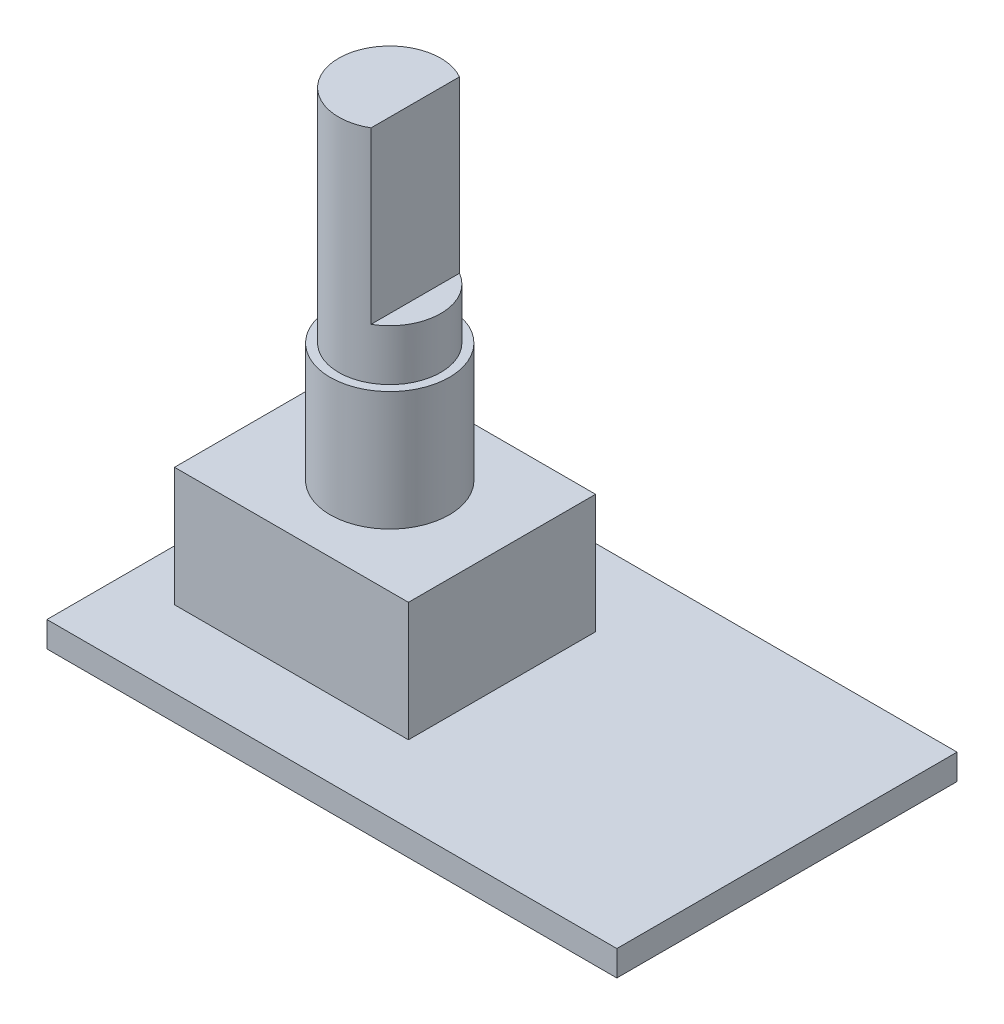
ISO-10303-21;
HEADER;
FILE_DESCRIPTION(('STEP AP214'),'2;1');
FILE_NAME('part.step','',(''),(''),'','','');
FILE_SCHEMA(('AUTOMOTIVE_DESIGN { 1 0 10303 214 1 1 1 1 }'));
ENDSEC;
DATA;
#1=APPLICATION_CONTEXT('core data for automotive mechanical design processes');
#2=APPLICATION_PROTOCOL_DEFINITION('international standard','automotive_design',2000,#1);
#3=PRODUCT_CONTEXT('',#1,'mechanical');
#4=PRODUCT('Part','Part','',(#3));
#5=PRODUCT_RELATED_PRODUCT_CATEGORY('part','',(#4));
#6=PRODUCT_DEFINITION_FORMATION('','',#4);
#7=PRODUCT_DEFINITION_CONTEXT('part definition',#1,'design');
#8=PRODUCT_DEFINITION('design','',#6,#7);
#9=PRODUCT_DEFINITION_SHAPE('','',#8);
#10=(LENGTH_UNIT() NAMED_UNIT(*) SI_UNIT(.MILLI.,.METRE.));
#11=(NAMED_UNIT(*) PLANE_ANGLE_UNIT() SI_UNIT($,.RADIAN.));
#12=(NAMED_UNIT(*) SI_UNIT($,.STERADIAN.) SOLID_ANGLE_UNIT());
#13=UNCERTAINTY_MEASURE_WITH_UNIT(LENGTH_MEASURE(1.E-05),#10,'distance_accuracy_value','');
#14=(GEOMETRIC_REPRESENTATION_CONTEXT(3) GLOBAL_UNCERTAINTY_ASSIGNED_CONTEXT((#13)) GLOBAL_UNIT_ASSIGNED_CONTEXT((#10,
#11,#12)) REPRESENTATION_CONTEXT('',''));
#15=CARTESIAN_POINT('',(0.,0.,0.));
#16=DIRECTION('',(0.,0.,1.));
#17=DIRECTION('',(1.,0.,0.));
#18=AXIS2_PLACEMENT_3D('',#15,#16,#17);
#19=CARTESIAN_POINT('',(1.13756613756614,15.5,1.78411013789592));
#20=DIRECTION('',(0.,1.,0.));
#21=DIRECTION('',(0.,0.,1.));
#22=AXIS2_PLACEMENT_3D('',#19,#20,#21);
#23=PLANE('',#22);
#24=CARTESIAN_POINT('',(1.13756613756614,15.5,1.78411013789592));
#25=DIRECTION('',(0.,1.,0.));
#26=DIRECTION('',(0.,0.,1.));
#27=AXIS2_PLACEMENT_3D('',#24,#25,#26);
#28=CIRCLE('',#27,3.5);
#29=CARTESIAN_POINT('',(1.13756613756614,15.5,5.28411013789592));
#30=VERTEX_POINT('',#29);
#31=EDGE_CURVE('E135',#30,#30,#28,.T.);
#32=ORIENTED_EDGE('',*,*,#31,.T.);
#33=EDGE_LOOP('',(#32));
#34=FACE_BOUND('',#33,.T.);
#35=CARTESIAN_POINT('',(1.13756613756614,15.5,1.78411013789592));
#36=DIRECTION('',(0.,1.,0.));
#37=DIRECTION('',(0.,0.,1.));
#38=AXIS2_PLACEMENT_3D('',#35,#36,#37);
#39=CIRCLE('',#38,3.);
#40=CARTESIAN_POINT('',(1.13756613756614,15.5,4.78411013789592));
#41=VERTEX_POINT('',#40);
#42=EDGE_CURVE('E128',#41,#41,#39,.T.);
#43=ORIENTED_EDGE('',*,*,#42,.F.);
#44=EDGE_LOOP('',(#43));
#45=FACE_BOUND('',#44,.T.);
#46=ADVANCED_FACE('F32',(#34,#45),#23,.T.);
#47=CARTESIAN_POINT('',(0.,8.5,0.));
#48=DIRECTION('',(0.,1.,0.));
#49=DIRECTION('',(0.,0.,1.));
#50=AXIS2_PLACEMENT_3D('',#47,#48,#49);
#51=PLANE('',#50);
#52=DIRECTION('',(0.,0.,1.));
#53=VECTOR('',#52,1.);
#54=CARTESIAN_POINT('',(-5.86243386243386,8.5,-3.56481481481482));
#55=LINE('',#54,#53);
#56=CARTESIAN_POINT('',(-5.86243386243386,8.5,-3.56481481481482));
#57=VERTEX_POINT('',#56);
#58=CARTESIAN_POINT('',(-5.86243386243386,8.5,7.43518518518518));
#59=VERTEX_POINT('',#58);
#60=EDGE_CURVE('E141',#57,#59,#55,.T.);
#61=ORIENTED_EDGE('',*,*,#60,.T.);
#62=DIRECTION('',(1.,0.,0.));
#63=VECTOR('',#62,1.);
#64=CARTESIAN_POINT('',(-5.86243386243386,8.5,7.43518518518518));
#65=LINE('',#64,#63);
#66=CARTESIAN_POINT('',(7.88756613756614,8.5,7.43518518518518));
#67=VERTEX_POINT('',#66);
#68=EDGE_CURVE('E144',#59,#67,#65,.T.);
#69=ORIENTED_EDGE('',*,*,#68,.T.);
#70=DIRECTION('',(0.,0.,-1.));
#71=VECTOR('',#70,1.);
#72=CARTESIAN_POINT('',(7.88756613756614,8.5,-3.56481481481482));
#73=LINE('',#72,#71);
#74=CARTESIAN_POINT('',(7.88756613756614,8.5,-3.56481481481482));
#75=VERTEX_POINT('',#74);
#76=EDGE_CURVE('E147',#67,#75,#73,.T.);
#77=ORIENTED_EDGE('',*,*,#76,.T.);
#78=DIRECTION('',(-1.,0.,0.));
#79=VECTOR('',#78,1.);
#80=CARTESIAN_POINT('',(-5.86243386243386,8.5,-3.56481481481482));
#81=LINE('',#80,#79);
#82=EDGE_CURVE('E149',#75,#57,#81,.T.);
#83=ORIENTED_EDGE('',*,*,#82,.T.);
#84=EDGE_LOOP('',(#61,#69,#77,#83));
#85=FACE_BOUND('',#84,.T.);
#86=CARTESIAN_POINT('',(1.13756613756614,8.5,1.78411013789592));
#87=DIRECTION('',(0.,1.,0.));
#88=DIRECTION('',(0.,0.,1.));
#89=AXIS2_PLACEMENT_3D('',#86,#87,#88);
#90=CIRCLE('',#89,3.5);
#91=CARTESIAN_POINT('',(1.13756613756614,8.5,5.28411013789592));
#92=VERTEX_POINT('',#91);
#93=EDGE_CURVE('E132',#92,#92,#90,.T.);
#94=ORIENTED_EDGE('',*,*,#93,.F.);
#95=EDGE_LOOP('',(#94));
#96=FACE_BOUND('',#95,.T.);
#97=ADVANCED_FACE('F220',(#85,#96),#51,.T.);
#98=CARTESIAN_POINT('',(0.,1.5,0.));
#99=DIRECTION('',(0.,1.,0.));
#100=DIRECTION('',(0.,0.,1.));
#101=AXIS2_PLACEMENT_3D('',#98,#99,#100);
#102=PLANE('',#101);
#103=DIRECTION('',(0.,0.,1.));
#104=VECTOR('',#103,1.);
#105=CARTESIAN_POINT('',(-8.86243386243386,1.5,-8.06481481481482));
#106=LINE('',#105,#104);
#107=CARTESIAN_POINT('',(-8.86243386243386,1.5,-8.06481481481482));
#108=VERTEX_POINT('',#107);
#109=CARTESIAN_POINT('',(-8.86243386243386,1.5,11.9351851851852));
#110=VERTEX_POINT('',#109);
#111=EDGE_CURVE('E168',#108,#110,#106,.T.);
#112=ORIENTED_EDGE('',*,*,#111,.T.);
#113=DIRECTION('',(1.,0.,0.));
#114=VECTOR('',#113,1.);
#115=CARTESIAN_POINT('',(-8.86243386243386,1.5,11.9351851851852));
#116=LINE('',#115,#114);
#117=CARTESIAN_POINT('',(24.6375661375662,1.5,11.9351851851852));
#118=VERTEX_POINT('',#117);
#119=EDGE_CURVE('E171',#110,#118,#116,.T.);
#120=ORIENTED_EDGE('',*,*,#119,.T.);
#121=DIRECTION('',(0.,0.,-1.));
#122=VECTOR('',#121,1.);
#123=CARTESIAN_POINT('',(24.6375661375661,1.5,-8.06481481481482));
#124=LINE('',#123,#122);
#125=CARTESIAN_POINT('',(24.6375661375661,1.5,-8.06481481481482));
#126=VERTEX_POINT('',#125);
#127=EDGE_CURVE('E174',#118,#126,#124,.T.);
#128=ORIENTED_EDGE('',*,*,#127,.T.);
#129=DIRECTION('',(-1.,0.,0.));
#130=VECTOR('',#129,1.);
#131=CARTESIAN_POINT('',(-8.86243386243386,1.5,-8.06481481481482));
#132=LINE('',#131,#130);
#133=EDGE_CURVE('E176',#126,#108,#132,.T.);
#134=ORIENTED_EDGE('',*,*,#133,.T.);
#135=EDGE_LOOP('',(#112,#120,#128,#134));
#136=FACE_BOUND('',#135,.T.);
#137=DIRECTION('',(1.,0.,0.));
#138=VECTOR('',#137,1.);
#139=CARTESIAN_POINT('',(-5.86243386243386,1.5,7.43518518518518));
#140=LINE('',#139,#138);
#141=CARTESIAN_POINT('',(-5.86243386243386,1.5,7.43518518518518));
#142=VERTEX_POINT('',#141);
#143=CARTESIAN_POINT('',(7.88756613756614,1.5,7.43518518518518));
#144=VERTEX_POINT('',#143);
#145=EDGE_CURVE('E154',#142,#144,#140,.T.);
#146=ORIENTED_EDGE('',*,*,#145,.F.);
#147=DIRECTION('',(0.,0.,1.));
#148=VECTOR('',#147,1.);
#149=CARTESIAN_POINT('',(-5.86243386243386,1.5,-3.56481481481482));
#150=LINE('',#149,#148);
#151=CARTESIAN_POINT('',(-5.86243386243386,1.5,-3.56481481481482));
#152=VERTEX_POINT('',#151);
#153=EDGE_CURVE('E138',#152,#142,#150,.T.);
#154=ORIENTED_EDGE('',*,*,#153,.F.);
#155=DIRECTION('',(-1.,0.,0.));
#156=VECTOR('',#155,1.);
#157=CARTESIAN_POINT('',(-5.86243386243386,1.5,-3.56481481481482));
#158=LINE('',#157,#156);
#159=CARTESIAN_POINT('',(7.88756613756614,1.5,-3.56481481481482));
#160=VERTEX_POINT('',#159);
#161=EDGE_CURVE('E145',#160,#152,#158,.T.);
#162=ORIENTED_EDGE('',*,*,#161,.F.);
#163=DIRECTION('',(0.,0.,-1.));
#164=VECTOR('',#163,1.);
#165=CARTESIAN_POINT('',(7.88756613756614,1.5,-3.56481481481482));
#166=LINE('',#165,#164);
#167=EDGE_CURVE('E156',#144,#160,#166,.T.);
#168=ORIENTED_EDGE('',*,*,#167,.F.);
#169=EDGE_LOOP('',(#146,#154,#162,#168));
#170=FACE_BOUND('',#169,.T.);
#171=ADVANCED_FACE('F210',(#136,#170),#102,.T.);
#172=CARTESIAN_POINT('',(-8.86243386243386,1.5,-8.06481481481482));
#173=DIRECTION('',(1.,0.,0.));
#174=DIRECTION('',(0.,0.,-1.));
#175=AXIS2_PLACEMENT_3D('',#172,#173,#174);
#176=PLANE('',#175);
#177=DIRECTION('',(0.,0.,1.));
#178=VECTOR('',#177,1.);
#179=CARTESIAN_POINT('',(-8.86243386243386,0.,-8.06481481481482));
#180=LINE('',#179,#178);
#181=CARTESIAN_POINT('',(-8.86243386243386,0.,-8.06481481481482));
#182=VERTEX_POINT('',#181);
#183=CARTESIAN_POINT('',(-8.86243386243386,0.,11.9351851851852));
#184=VERTEX_POINT('',#183);
#185=EDGE_CURVE('E167',#182,#184,#180,.T.);
#186=ORIENTED_EDGE('',*,*,#185,.T.);
#187=DIRECTION('',(0.,-1.,0.));
#188=VECTOR('',#187,1.);
#189=CARTESIAN_POINT('',(-8.86243386243386,1.5,11.9351851851852));
#190=LINE('',#189,#188);
#191=EDGE_CURVE('E11',#110,#184,#190,.T.);
#192=ORIENTED_EDGE('',*,*,#191,.F.);
#193=ORIENTED_EDGE('',*,*,#111,.F.);
#194=DIRECTION('',(0.,-1.,0.));
#195=VECTOR('',#194,1.);
#196=CARTESIAN_POINT('',(-8.86243386243386,1.5,-8.06481481481482));
#197=LINE('',#196,#195);
#198=EDGE_CURVE('E178',#108,#182,#197,.T.);
#199=ORIENTED_EDGE('',*,*,#198,.T.);
#200=EDGE_LOOP('',(#186,#192,#193,#199));
#201=FACE_BOUND('',#200,.T.);
#202=ADVANCED_FACE('F34',(#201),#176,.F.);
#203=CARTESIAN_POINT('',(-8.86243386243386,1.5,11.9351851851852));
#204=DIRECTION('',(0.,0.,-1.));
#205=DIRECTION('',(-1.,0.,0.));
#206=AXIS2_PLACEMENT_3D('',#203,#204,#205);
#207=PLANE('',#206);
#208=DIRECTION('',(1.,0.,0.));
#209=VECTOR('',#208,1.);
#210=CARTESIAN_POINT('',(-8.86243386243386,0.,11.9351851851852));
#211=LINE('',#210,#209);
#212=CARTESIAN_POINT('',(24.6375661375662,0.,11.9351851851852));
#213=VERTEX_POINT('',#212);
#214=EDGE_CURVE('E181',#184,#213,#211,.T.);
#215=ORIENTED_EDGE('',*,*,#214,.T.);
#216=DIRECTION('',(0.,-1.,0.));
#217=VECTOR('',#216,1.);
#218=CARTESIAN_POINT('',(24.6375661375662,1.5,11.9351851851852));
#219=LINE('',#218,#217);
#220=EDGE_CURVE('E40',#118,#213,#219,.T.);
#221=ORIENTED_EDGE('',*,*,#220,.F.);
#222=ORIENTED_EDGE('',*,*,#119,.F.);
#223=ORIENTED_EDGE('',*,*,#191,.T.);
#224=EDGE_LOOP('',(#215,#221,#222,#223));
#225=FACE_BOUND('',#224,.T.);
#226=ADVANCED_FACE('F212',(#225),#207,.F.);
#227=CARTESIAN_POINT('',(24.6375661375661,1.5,-8.06481481481482));
#228=DIRECTION('',(-1.,0.,0.));
#229=DIRECTION('',(0.,0.,1.));
#230=AXIS2_PLACEMENT_3D('',#227,#228,#229);
#231=PLANE('',#230);
#232=DIRECTION('',(0.,0.,-1.));
#233=VECTOR('',#232,1.);
#234=CARTESIAN_POINT('',(24.6375661375661,0.,-8.06481481481482));
#235=LINE('',#234,#233);
#236=CARTESIAN_POINT('',(24.6375661375661,0.,-8.06481481481482));
#237=VERTEX_POINT('',#236);
#238=EDGE_CURVE('E183',#213,#237,#235,.T.);
#239=ORIENTED_EDGE('',*,*,#238,.T.);
#240=DIRECTION('',(0.,-1.,0.));
#241=VECTOR('',#240,1.);
#242=CARTESIAN_POINT('',(24.6375661375661,1.5,-8.06481481481482));
#243=LINE('',#242,#241);
#244=EDGE_CURVE('E188',#126,#237,#243,.T.);
#245=ORIENTED_EDGE('',*,*,#244,.F.);
#246=ORIENTED_EDGE('',*,*,#127,.F.);
#247=ORIENTED_EDGE('',*,*,#220,.T.);
#248=EDGE_LOOP('',(#239,#245,#246,#247));
#249=FACE_BOUND('',#248,.T.);
#250=ADVANCED_FACE('F195',(#249),#231,.F.);
#251=CARTESIAN_POINT('',(-8.86243386243386,1.5,-8.06481481481482));
#252=DIRECTION('',(0.,0.,1.));
#253=DIRECTION('',(1.,0.,0.));
#254=AXIS2_PLACEMENT_3D('',#251,#252,#253);
#255=PLANE('',#254);
#256=DIRECTION('',(-1.,0.,0.));
#257=VECTOR('',#256,1.);
#258=CARTESIAN_POINT('',(-8.86243386243386,0.,-8.06481481481482));
#259=LINE('',#258,#257);
#260=EDGE_CURVE('E172',#237,#182,#259,.T.);
#261=ORIENTED_EDGE('',*,*,#260,.T.);
#262=ORIENTED_EDGE('',*,*,#198,.F.);
#263=ORIENTED_EDGE('',*,*,#133,.F.);
#264=ORIENTED_EDGE('',*,*,#244,.T.);
#265=EDGE_LOOP('',(#261,#262,#263,#264));
#266=FACE_BOUND('',#265,.T.);
#267=ADVANCED_FACE('F204',(#266),#255,.F.);
#268=CARTESIAN_POINT('',(0.,0.,0.));
#269=DIRECTION('',(0.,1.,0.));
#270=DIRECTION('',(0.,0.,1.));
#271=AXIS2_PLACEMENT_3D('',#268,#269,#270);
#272=PLANE('',#271);
#273=ORIENTED_EDGE('',*,*,#185,.F.);
#274=ORIENTED_EDGE('',*,*,#260,.F.);
#275=ORIENTED_EDGE('',*,*,#238,.F.);
#276=ORIENTED_EDGE('',*,*,#214,.F.);
#277=EDGE_LOOP('',(#273,#274,#275,#276));
#278=FACE_BOUND('',#277,.T.);
#279=ADVANCED_FACE('F201',(#278),#272,.F.);
#280=CARTESIAN_POINT('',(-5.86243386243386,8.5,-3.56481481481482));
#281=DIRECTION('',(1.,0.,0.));
#282=DIRECTION('',(0.,0.,-1.));
#283=AXIS2_PLACEMENT_3D('',#280,#281,#282);
#284=PLANE('',#283);
#285=ORIENTED_EDGE('',*,*,#153,.T.);
#286=DIRECTION('',(0.,-1.,0.));
#287=VECTOR('',#286,1.);
#288=CARTESIAN_POINT('',(-5.86243386243386,8.5,7.43518518518518));
#289=LINE('',#288,#287);
#290=EDGE_CURVE('E165',#59,#142,#289,.T.);
#291=ORIENTED_EDGE('',*,*,#290,.F.);
#292=ORIENTED_EDGE('',*,*,#60,.F.);
#293=DIRECTION('',(0.,-1.,0.));
#294=VECTOR('',#293,1.);
#295=CARTESIAN_POINT('',(-5.86243386243386,8.5,-3.56481481481482));
#296=LINE('',#295,#294);
#297=EDGE_CURVE('E151',#57,#152,#296,.T.);
#298=ORIENTED_EDGE('',*,*,#297,.T.);
#299=EDGE_LOOP('',(#285,#291,#292,#298));
#300=FACE_BOUND('',#299,.T.);
#301=ADVANCED_FACE('F246',(#300),#284,.F.);
#302=CARTESIAN_POINT('',(-5.86243386243386,8.5,7.43518518518518));
#303=DIRECTION('',(0.,0.,-1.));
#304=DIRECTION('',(-1.,0.,0.));
#305=AXIS2_PLACEMENT_3D('',#302,#303,#304);
#306=PLANE('',#305);
#307=ORIENTED_EDGE('',*,*,#145,.T.);
#308=DIRECTION('',(0.,-1.,0.));
#309=VECTOR('',#308,1.);
#310=CARTESIAN_POINT('',(7.88756613756614,8.5,7.43518518518518));
#311=LINE('',#310,#309);
#312=EDGE_CURVE('E162',#67,#144,#311,.T.);
#313=ORIENTED_EDGE('',*,*,#312,.F.);
#314=ORIENTED_EDGE('',*,*,#68,.F.);
#315=ORIENTED_EDGE('',*,*,#290,.T.);
#316=EDGE_LOOP('',(#307,#313,#314,#315));
#317=FACE_BOUND('',#316,.T.);
#318=ADVANCED_FACE('F242',(#317),#306,.F.);
#319=CARTESIAN_POINT('',(7.88756613756614,8.5,-3.56481481481482));
#320=DIRECTION('',(-1.,0.,0.));
#321=DIRECTION('',(0.,0.,1.));
#322=AXIS2_PLACEMENT_3D('',#319,#320,#321);
#323=PLANE('',#322);
#324=ORIENTED_EDGE('',*,*,#167,.T.);
#325=DIRECTION('',(0.,-1.,0.));
#326=VECTOR('',#325,1.);
#327=CARTESIAN_POINT('',(7.88756613756614,8.5,-3.56481481481482));
#328=LINE('',#327,#326);
#329=EDGE_CURVE('E55',#75,#160,#328,.T.);
#330=ORIENTED_EDGE('',*,*,#329,.F.);
#331=ORIENTED_EDGE('',*,*,#76,.F.);
#332=ORIENTED_EDGE('',*,*,#312,.T.);
#333=EDGE_LOOP('',(#324,#330,#331,#332));
#334=FACE_BOUND('',#333,.T.);
#335=ADVANCED_FACE('F239',(#334),#323,.F.);
#336=CARTESIAN_POINT('',(-5.86243386243386,8.5,-3.56481481481482));
#337=DIRECTION('',(0.,0.,1.));
#338=DIRECTION('',(1.,0.,0.));
#339=AXIS2_PLACEMENT_3D('',#336,#337,#338);
#340=PLANE('',#339);
#341=ORIENTED_EDGE('',*,*,#161,.T.);
#342=ORIENTED_EDGE('',*,*,#297,.F.);
#343=ORIENTED_EDGE('',*,*,#82,.F.);
#344=ORIENTED_EDGE('',*,*,#329,.T.);
#345=EDGE_LOOP('',(#341,#342,#343,#344));
#346=FACE_BOUND('',#345,.T.);
#347=ADVANCED_FACE('F234',(#346),#340,.F.);
#348=CARTESIAN_POINT('',(1.13756613756614,15.5,1.78411013789592));
#349=DIRECTION('',(0.,-1.,0.));
#350=DIRECTION('',(0.,0.,-1.));
#351=AXIS2_PLACEMENT_3D('',#348,#349,#350);
#352=CYLINDRICAL_SURFACE('',#351,3.5);
#353=ORIENTED_EDGE('',*,*,#31,.F.);
#354=EDGE_LOOP('',(#353));
#355=FACE_BOUND('',#354,.T.);
#356=ORIENTED_EDGE('',*,*,#93,.T.);
#357=EDGE_LOOP('',(#356));
#358=FACE_BOUND('',#357,.T.);
#359=ADVANCED_FACE('F232',(#355,#358),#352,.T.);
#360=CARTESIAN_POINT('',(1.13756613756614,28.5,1.78411013789592));
#361=DIRECTION('',(0.,-1.,0.));
#362=DIRECTION('',(0.,0.,-1.));
#363=AXIS2_PLACEMENT_3D('',#360,#361,#362);
#364=CYLINDRICAL_SURFACE('',#363,3.);
#365=CARTESIAN_POINT('',(1.13756613756614,28.5,1.78411013789592));
#366=DIRECTION('',(0.,1.,0.));
#367=DIRECTION('',(0.,0.,1.));
#368=AXIS2_PLACEMENT_3D('',#365,#366,#367);
#369=CIRCLE('',#368,3.);
#370=CARTESIAN_POINT('',(2.63756613756614,28.5,-0.813966073457395));
#371=VERTEX_POINT('',#370);
#372=CARTESIAN_POINT('',(2.63756613756614,28.5,4.38218634924924));
#373=VERTEX_POINT('',#372);
#374=EDGE_CURVE('E130',#371,#373,#369,.T.);
#375=ORIENTED_EDGE('',*,*,#374,.F.);
#376=DIRECTION('',(0.,1.,0.));
#377=VECTOR('',#376,1.);
#378=CARTESIAN_POINT('',(2.63756613756614,18.5,-0.813966073457396));
#379=LINE('',#378,#377);
#380=CARTESIAN_POINT('',(2.63756613756614,18.5,-0.813966073457396));
#381=VERTEX_POINT('',#380);
#382=EDGE_CURVE('E47',#381,#371,#379,.T.);
#383=ORIENTED_EDGE('',*,*,#382,.F.);
#384=CARTESIAN_POINT('',(1.13756613756614,18.5,1.78411013789592));
#385=DIRECTION('',(0.,1.,0.));
#386=DIRECTION('',(0.,0.,1.));
#387=AXIS2_PLACEMENT_3D('',#384,#385,#386);
#388=CIRCLE('',#387,3.);
#389=CARTESIAN_POINT('',(2.63756613756614,18.5,4.38218634924924));
#390=VERTEX_POINT('',#389);
#391=EDGE_CURVE('E118',#390,#381,#388,.T.);
#392=ORIENTED_EDGE('',*,*,#391,.F.);
#393=DIRECTION('',(0.,1.,0.));
#394=VECTOR('',#393,1.);
#395=CARTESIAN_POINT('',(2.63756613756614,18.5,4.38218634924924));
#396=LINE('',#395,#394);
#397=EDGE_CURVE('E108',#390,#373,#396,.T.);
#398=ORIENTED_EDGE('',*,*,#397,.T.);
#399=EDGE_LOOP('',(#375,#383,#392,#398));
#400=FACE_BOUND('',#399,.T.);
#401=ORIENTED_EDGE('',*,*,#42,.T.);
#402=EDGE_LOOP('',(#401));
#403=FACE_BOUND('',#402,.T.);
#404=ADVANCED_FACE('F123',(#400,#403),#364,.T.);
#405=CARTESIAN_POINT('',(1.13756613756614,28.5,1.78411013789592));
#406=DIRECTION('',(0.,1.,0.));
#407=DIRECTION('',(0.,0.,1.));
#408=AXIS2_PLACEMENT_3D('',#405,#406,#407);
#409=PLANE('',#408);
#410=DIRECTION('',(0.,0.,1.));
#411=VECTOR('',#410,1.);
#412=CARTESIAN_POINT('',(2.63756613756614,28.5,1.78411013789592));
#413=LINE('',#412,#411);
#414=EDGE_CURVE('E113',#371,#373,#413,.T.);
#415=ORIENTED_EDGE('',*,*,#414,.F.);
#416=ORIENTED_EDGE('',*,*,#374,.T.);
#417=EDGE_LOOP('',(#415,#416));
#418=FACE_BOUND('',#417,.T.);
#419=ADVANCED_FACE('F292',(#418),#409,.T.);
#420=CARTESIAN_POINT('',(2.63756613756614,18.5,1.78411013789592));
#421=DIRECTION('',(-1.,0.,0.));
#422=DIRECTION('',(0.,0.,1.));
#423=AXIS2_PLACEMENT_3D('',#420,#421,#422);
#424=PLANE('',#423);
#425=ORIENTED_EDGE('',*,*,#414,.T.);
#426=ORIENTED_EDGE('',*,*,#397,.F.);
#427=DIRECTION('',(0.,0.,1.));
#428=VECTOR('',#427,1.);
#429=CARTESIAN_POINT('',(2.63756613756614,18.5,1.78411013789592));
#430=LINE('',#429,#428);
#431=EDGE_CURVE('E111',#381,#390,#430,.T.);
#432=ORIENTED_EDGE('',*,*,#431,.F.);
#433=ORIENTED_EDGE('',*,*,#382,.T.);
#434=EDGE_LOOP('',(#425,#426,#432,#433));
#435=FACE_BOUND('',#434,.T.);
#436=ADVANCED_FACE('F110',(#435),#424,.F.);
#437=CARTESIAN_POINT('',(1.13756613756614,18.5,1.78411013789592));
#438=DIRECTION('',(0.,1.,0.));
#439=DIRECTION('',(0.,0.,1.));
#440=AXIS2_PLACEMENT_3D('',#437,#438,#439);
#441=PLANE('',#440);
#442=ORIENTED_EDGE('',*,*,#431,.T.);
#443=ORIENTED_EDGE('',*,*,#391,.T.);
#444=EDGE_LOOP('',(#442,#443));
#445=FACE_BOUND('',#444,.T.);
#446=ADVANCED_FACE('F121',(#445),#441,.T.);
#447=CLOSED_SHELL('',(#46,#97,#171,#202,#226,#250,#267,#279,#301,#318,#335,#347,#359,#404,#419,
#436,#446));
#448=MANIFOLD_SOLID_BREP('B2',#447);
#449=ADVANCED_BREP_SHAPE_REPRESENTATION('',(#18,#448),#14);
#450=SHAPE_DEFINITION_REPRESENTATION(#9,#449);
ENDSEC;
END-ISO-10303-21;
